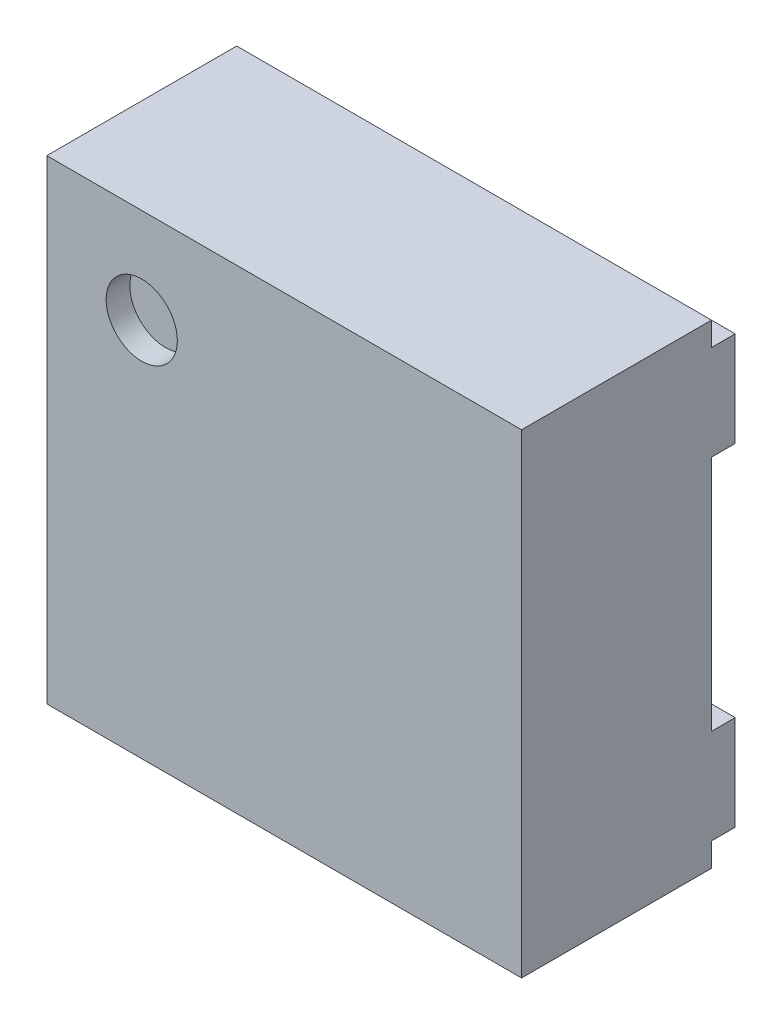
ISO-10303-21;
HEADER;
FILE_DESCRIPTION(('STEP AP214'),'2;1');
FILE_NAME('part.step','',(''),(''),'','','');
FILE_SCHEMA(('AUTOMOTIVE_DESIGN { 1 0 10303 214 1 1 1 1 }'));
ENDSEC;
DATA;
#1=APPLICATION_CONTEXT('core data for automotive mechanical design processes');
#2=APPLICATION_PROTOCOL_DEFINITION('international standard','automotive_design',2000,#1);
#3=PRODUCT_CONTEXT('',#1,'mechanical');
#4=PRODUCT('Part','Part','',(#3));
#5=PRODUCT_RELATED_PRODUCT_CATEGORY('part','',(#4));
#6=PRODUCT_DEFINITION_FORMATION('','',#4);
#7=PRODUCT_DEFINITION_CONTEXT('part definition',#1,'design');
#8=PRODUCT_DEFINITION('design','',#6,#7);
#9=PRODUCT_DEFINITION_SHAPE('','',#8);
#10=(LENGTH_UNIT() NAMED_UNIT(*) SI_UNIT(.MILLI.,.METRE.));
#11=(NAMED_UNIT(*) PLANE_ANGLE_UNIT() SI_UNIT($,.RADIAN.));
#12=(NAMED_UNIT(*) SI_UNIT($,.STERADIAN.) SOLID_ANGLE_UNIT());
#13=UNCERTAINTY_MEASURE_WITH_UNIT(LENGTH_MEASURE(1.E-05),#10,'distance_accuracy_value','');
#14=(GEOMETRIC_REPRESENTATION_CONTEXT(3) GLOBAL_UNCERTAINTY_ASSIGNED_CONTEXT((#13)) GLOBAL_UNIT_ASSIGNED_CONTEXT((#10,
#11,#12)) REPRESENTATION_CONTEXT('',''));
#15=CARTESIAN_POINT('',(0.,0.,0.));
#16=DIRECTION('',(0.,0.,1.));
#17=DIRECTION('',(1.,0.,0.));
#18=AXIS2_PLACEMENT_3D('',#15,#16,#17);
#19=CARTESIAN_POINT('',(0.39594875162,0.369759001296,-0.05));
#20=DIRECTION('',(0.,0.,-1.));
#21=DIRECTION('',(-1.,0.,0.));
#22=AXIS2_PLACEMENT_3D('',#19,#20,#21);
#23=PLANE('',#22);
#24=DIRECTION('',(0.,1.,0.));
#25=VECTOR('',#24,1.);
#26=CARTESIAN_POINT('',(0.25,0.4,-0.05));
#27=LINE('',#26,#25);
#28=CARTESIAN_POINT('',(0.25,0.45,-0.05));
#29=VERTEX_POINT('',#28);
#30=CARTESIAN_POINT('',(0.249999999999995,0.399999999999994,-0.05));
#31=VERTEX_POINT('',#30);
#32=EDGE_CURVE('E401',#29,#31,#27,.F.);
#33=ORIENTED_EDGE('',*,*,#32,.F.);
#34=DIRECTION('',(1.,0.,0.));
#35=VECTOR('',#34,1.);
#36=CARTESIAN_POINT('',(0.25,0.45,-0.05));
#37=LINE('',#36,#35);
#38=CARTESIAN_POINT('',(0.5,0.45,-0.05));
#39=VERTEX_POINT('',#38);
#40=EDGE_CURVE('E395',#39,#29,#37,.F.);
#41=ORIENTED_EDGE('',*,*,#40,.F.);
#42=DIRECTION('',(0.,1.,0.));
#43=VECTOR('',#42,1.);
#44=CARTESIAN_POINT('',(0.5,0.45,-0.05));
#45=LINE('',#44,#43);
#46=CARTESIAN_POINT('',(0.5,0.25,-0.05));
#47=VERTEX_POINT('',#46);
#48=EDGE_CURVE('E438',#47,#39,#45,.T.);
#49=ORIENTED_EDGE('',*,*,#48,.F.);
#50=DIRECTION('',(1.,0.,0.));
#51=VECTOR('',#50,1.);
#52=CARTESIAN_POINT('',(0.5,0.25,-0.05));
#53=LINE('',#52,#51);
#54=CARTESIAN_POINT('',(0.43,0.25,-0.05));
#55=VERTEX_POINT('',#54);
#56=EDGE_CURVE('E412',#55,#47,#53,.T.);
#57=ORIENTED_EDGE('',*,*,#56,.F.);
#58=DIRECTION('',(0.768221279597458,-0.640184399664382,0.));
#59=VECTOR('',#58,1.);
#60=CARTESIAN_POINT('',(0.43,0.25,-0.05));
#61=LINE('',#60,#59);
#62=EDGE_CURVE('E407',#31,#55,#61,.T.);
#63=ORIENTED_EDGE('',*,*,#62,.F.);
#64=EDGE_LOOP('',(#33,#41,#49,#57,#63));
#65=FACE_BOUND('',#64,.T.);
#66=ADVANCED_FACE('F17',(#65),#23,.T.);
#67=CARTESIAN_POINT('',(-0.39594875162,0.369759001296,-0.05));
#68=DIRECTION('',(0.,0.,1.));
#69=DIRECTION('',(1.,0.,0.));
#70=AXIS2_PLACEMENT_3D('',#67,#68,#69);
#71=PLANE('',#70);
#72=DIRECTION('',(0.,1.,0.));
#73=VECTOR('',#72,1.);
#74=CARTESIAN_POINT('',(-0.25,0.4,-0.05));
#75=LINE('',#74,#73);
#76=CARTESIAN_POINT('',(-0.25,0.45,-0.05));
#77=VERTEX_POINT('',#76);
#78=CARTESIAN_POINT('',(-0.249999999999995,0.399999999999994,-0.05));
#79=VERTEX_POINT('',#78);
#80=EDGE_CURVE('E382',#77,#79,#75,.F.);
#81=ORIENTED_EDGE('',*,*,#80,.T.);
#82=DIRECTION('',(-0.768221279597458,-0.640184399664382,0.));
#83=VECTOR('',#82,1.);
#84=CARTESIAN_POINT('',(-0.43,0.25,-0.05));
#85=LINE('',#84,#83);
#86=CARTESIAN_POINT('',(-0.43,0.25,-0.05));
#87=VERTEX_POINT('',#86);
#88=EDGE_CURVE('E377',#79,#87,#85,.T.);
#89=ORIENTED_EDGE('',*,*,#88,.T.);
#90=DIRECTION('',(1.,0.,0.));
#91=VECTOR('',#90,1.);
#92=CARTESIAN_POINT('',(-0.5,0.25,-0.05));
#93=LINE('',#92,#91);
#94=CARTESIAN_POINT('',(-0.5,0.25,-0.05));
#95=VERTEX_POINT('',#94);
#96=EDGE_CURVE('E372',#87,#95,#93,.F.);
#97=ORIENTED_EDGE('',*,*,#96,.T.);
#98=DIRECTION('',(0.,1.,0.));
#99=VECTOR('',#98,1.);
#100=CARTESIAN_POINT('',(-0.5,0.45,-0.05));
#101=LINE('',#100,#99);
#102=CARTESIAN_POINT('',(-0.5,0.45,-0.05));
#103=VERTEX_POINT('',#102);
#104=EDGE_CURVE('E440',#95,#103,#101,.T.);
#105=ORIENTED_EDGE('',*,*,#104,.T.);
#106=DIRECTION('',(1.,0.,0.));
#107=VECTOR('',#106,1.);
#108=CARTESIAN_POINT('',(-0.25,0.45,-0.05));
#109=LINE('',#108,#107);
#110=EDGE_CURVE('E387',#103,#77,#109,.T.);
#111=ORIENTED_EDGE('',*,*,#110,.T.);
#112=EDGE_LOOP('',(#81,#89,#97,#105,#111));
#113=FACE_BOUND('',#112,.T.);
#114=ADVANCED_FACE('F640',(#113),#71,.F.);
#115=CARTESIAN_POINT('',(-0.39594875162,-0.369759001296,-0.05));
#116=DIRECTION('',(0.,0.,-1.));
#117=DIRECTION('',(-1.,0.,0.));
#118=AXIS2_PLACEMENT_3D('',#115,#116,#117);
#119=PLANE('',#118);
#120=DIRECTION('',(0.,1.,0.));
#121=VECTOR('',#120,1.);
#122=CARTESIAN_POINT('',(-0.25,-0.4,-0.05));
#123=LINE('',#122,#121);
#124=CARTESIAN_POINT('',(-0.25,-0.45,-0.05));
#125=VERTEX_POINT('',#124);
#126=CARTESIAN_POINT('',(-0.249999999999995,-0.399999999999994,-0.05));
#127=VERTEX_POINT('',#126);
#128=EDGE_CURVE('E353',#125,#127,#123,.T.);
#129=ORIENTED_EDGE('',*,*,#128,.F.);
#130=DIRECTION('',(1.,0.,0.));
#131=VECTOR('',#130,1.);
#132=CARTESIAN_POINT('',(-0.25,-0.45,-0.05));
#133=LINE('',#132,#131);
#134=CARTESIAN_POINT('',(-0.5,-0.45,-0.05));
#135=VERTEX_POINT('',#134);
#136=EDGE_CURVE('E435',#135,#125,#133,.T.);
#137=ORIENTED_EDGE('',*,*,#136,.F.);
#138=DIRECTION('',(0.,1.,0.));
#139=VECTOR('',#138,1.);
#140=CARTESIAN_POINT('',(-0.5,-0.45,-0.05));
#141=LINE('',#140,#139);
#142=CARTESIAN_POINT('',(-0.5,-0.25,-0.05));
#143=VERTEX_POINT('',#142);
#144=EDGE_CURVE('E239',#143,#135,#141,.F.);
#145=ORIENTED_EDGE('',*,*,#144,.F.);
#146=DIRECTION('',(1.,0.,0.));
#147=VECTOR('',#146,1.);
#148=CARTESIAN_POINT('',(-0.5,-0.25,-0.05));
#149=LINE('',#148,#147);
#150=CARTESIAN_POINT('',(-0.43,-0.25,-0.05));
#151=VERTEX_POINT('',#150);
#152=EDGE_CURVE('E364',#151,#143,#149,.F.);
#153=ORIENTED_EDGE('',*,*,#152,.F.);
#154=DIRECTION('',(-0.768221279597458,0.640184399664382,0.));
#155=VECTOR('',#154,1.);
#156=CARTESIAN_POINT('',(-0.43,-0.25,-0.05));
#157=LINE('',#156,#155);
#158=EDGE_CURVE('E359',#127,#151,#157,.T.);
#159=ORIENTED_EDGE('',*,*,#158,.F.);
#160=EDGE_LOOP('',(#129,#137,#145,#153,#159));
#161=FACE_BOUND('',#160,.T.);
#162=ADVANCED_FACE('F644',(#161),#119,.T.);
#163=CARTESIAN_POINT('',(-0.003307671123042,0.003307671123042,-0.05));
#164=DIRECTION('',(0.,0.,1.));
#165=DIRECTION('',(1.,0.,0.));
#166=AXIS2_PLACEMENT_3D('',#163,#164,#165);
#167=PLANE('',#166);
#168=CARTESIAN_POINT('',(-0.164807389148,0.164807389148,-0.05));
#169=DIRECTION('',(0.,0.,-1.));
#170=DIRECTION('',(-1.,0.,0.));
#171=AXIS2_PLACEMENT_3D('',#168,#169,#170);
#172=CIRCLE('',#171,0.04059538739318);
#173=CARTESIAN_POINT('',(-0.197989898732166,0.141421356237327,-0.05));
#174=VERTEX_POINT('',#173);
#175=CARTESIAN_POINT('',(-0.141421356237562,0.197989898732438,-0.05));
#176=VERTEX_POINT('',#175);
#177=EDGE_CURVE('E20',#174,#176,#172,.F.);
#178=ORIENTED_EDGE('',*,*,#177,.T.);
#179=DIRECTION('',(0.707106781186548,0.707106781186548,0.));
#180=VECTOR('',#179,1.);
#181=CARTESIAN_POINT('',(0.,0.33941125497,-0.05));
#182=LINE('',#181,#180);
#183=CARTESIAN_POINT('',(0.,0.33941125497,-0.05));
#184=VERTEX_POINT('',#183);
#185=EDGE_CURVE('E218',#176,#184,#182,.T.);
#186=ORIENTED_EDGE('',*,*,#185,.T.);
#187=DIRECTION('',(0.707106781186548,-0.707106781186548,0.));
#188=VECTOR('',#187,1.);
#189=CARTESIAN_POINT('',(0.33941125497,0.,-0.05));
#190=LINE('',#189,#188);
#191=CARTESIAN_POINT('',(0.33941125497,0.,-0.05));
#192=VERTEX_POINT('',#191);
#193=EDGE_CURVE('E230',#184,#192,#190,.T.);
#194=ORIENTED_EDGE('',*,*,#193,.T.);
#195=DIRECTION('',(-0.707106781186548,-0.707106781186548,0.));
#196=VECTOR('',#195,1.);
#197=CARTESIAN_POINT('',(0.,-0.33941125497,-0.05));
#198=LINE('',#197,#196);
#199=CARTESIAN_POINT('',(0.,-0.33941125497,-0.05));
#200=VERTEX_POINT('',#199);
#201=EDGE_CURVE('E247',#192,#200,#198,.T.);
#202=ORIENTED_EDGE('',*,*,#201,.T.);
#203=DIRECTION('',(-0.707106781186548,0.707106781186548,0.));
#204=VECTOR('',#203,1.);
#205=CARTESIAN_POINT('',(-0.33941125497,0.,-0.05));
#206=LINE('',#205,#204);
#207=CARTESIAN_POINT('',(-0.33941125497,0.,-0.05));
#208=VERTEX_POINT('',#207);
#209=EDGE_CURVE('E249',#200,#208,#206,.T.);
#210=ORIENTED_EDGE('',*,*,#209,.T.);
#211=DIRECTION('',(-0.707106781186548,-0.707106781186548,0.));
#212=VECTOR('',#211,1.);
#213=CARTESIAN_POINT('',(-0.33941125497,0.,-0.05));
#214=LINE('',#213,#212);
#215=EDGE_CURVE('E212',#174,#208,#214,.T.);
#216=ORIENTED_EDGE('',*,*,#215,.F.);
#217=EDGE_LOOP('',(#178,#186,#194,#202,#210,#216));
#218=FACE_BOUND('',#217,.T.);
#219=ADVANCED_FACE('F216',(#218),#167,.F.);
#220=CARTESIAN_POINT('',(0.39594875162,-0.369759001296,-0.05));
#221=DIRECTION('',(0.,0.,1.));
#222=DIRECTION('',(1.,0.,0.));
#223=AXIS2_PLACEMENT_3D('',#220,#221,#222);
#224=PLANE('',#223);
#225=DIRECTION('',(0.,1.,0.));
#226=VECTOR('',#225,1.);
#227=CARTESIAN_POINT('',(0.25,-0.4,-0.05));
#228=LINE('',#227,#226);
#229=CARTESIAN_POINT('',(0.25,-0.45,-0.05));
#230=VERTEX_POINT('',#229);
#231=CARTESIAN_POINT('',(0.249999999999995,-0.399999999999994,-0.05));
#232=VERTEX_POINT('',#231);
#233=EDGE_CURVE('E428',#230,#232,#228,.T.);
#234=ORIENTED_EDGE('',*,*,#233,.T.);
#235=DIRECTION('',(0.768221279597458,0.640184399664382,0.));
#236=VECTOR('',#235,1.);
#237=CARTESIAN_POINT('',(0.43,-0.25,-0.05));
#238=LINE('',#237,#236);
#239=CARTESIAN_POINT('',(0.43,-0.25,-0.05));
#240=VERTEX_POINT('',#239);
#241=EDGE_CURVE('E423',#232,#240,#238,.T.);
#242=ORIENTED_EDGE('',*,*,#241,.T.);
#243=DIRECTION('',(1.,0.,0.));
#244=VECTOR('',#243,1.);
#245=CARTESIAN_POINT('',(0.5,-0.25,-0.05));
#246=LINE('',#245,#244);
#247=CARTESIAN_POINT('',(0.5,-0.25,-0.05));
#248=VERTEX_POINT('',#247);
#249=EDGE_CURVE('E418',#240,#248,#246,.T.);
#250=ORIENTED_EDGE('',*,*,#249,.T.);
#251=DIRECTION('',(0.,1.,0.));
#252=VECTOR('',#251,1.);
#253=CARTESIAN_POINT('',(0.5,-0.45,-0.05));
#254=LINE('',#253,#252);
#255=CARTESIAN_POINT('',(0.5,-0.45,-0.05));
#256=VERTEX_POINT('',#255);
#257=EDGE_CURVE('E322',#248,#256,#254,.F.);
#258=ORIENTED_EDGE('',*,*,#257,.T.);
#259=DIRECTION('',(1.,0.,0.));
#260=VECTOR('',#259,1.);
#261=CARTESIAN_POINT('',(0.25,-0.45,-0.05));
#262=LINE('',#261,#260);
#263=EDGE_CURVE('E430',#256,#230,#262,.F.);
#264=ORIENTED_EDGE('',*,*,#263,.T.);
#265=EDGE_LOOP('',(#234,#242,#250,#258,#264));
#266=FACE_BOUND('',#265,.T.);
#267=ADVANCED_FACE('F525',(#266),#224,.F.);
#268=CARTESIAN_POINT('',(-0.25,-0.45,-0.05));
#269=DIRECTION('',(0.,-1.,0.));
#270=DIRECTION('',(0.,0.,-1.));
#271=AXIS2_PLACEMENT_3D('',#268,#269,#270);
#272=PLANE('',#271);
#273=DIRECTION('',(1.,0.,0.));
#274=VECTOR('',#273,1.);
#275=CARTESIAN_POINT('',(0.,-0.45,0.));
#276=LINE('',#275,#274);
#277=CARTESIAN_POINT('',(-0.25,-0.45,0.));
#278=VERTEX_POINT('',#277);
#279=CARTESIAN_POINT('',(-0.5,-0.45,0.));
#280=VERTEX_POINT('',#279);
#281=EDGE_CURVE('E314',#278,#280,#276,.F.);
#282=ORIENTED_EDGE('',*,*,#281,.T.);
#283=DIRECTION('',(0.,0.,-1.));
#284=VECTOR('',#283,1.);
#285=CARTESIAN_POINT('',(-0.5,-0.45,-0.05));
#286=LINE('',#285,#284);
#287=EDGE_CURVE('E432',#280,#135,#286,.T.);
#288=ORIENTED_EDGE('',*,*,#287,.T.);
#289=ORIENTED_EDGE('',*,*,#136,.T.);
#290=DIRECTION('',(0.,0.,-1.));
#291=VECTOR('',#290,1.);
#292=CARTESIAN_POINT('',(-0.25,-0.45,-0.05));
#293=LINE('',#292,#291);
#294=EDGE_CURVE('E250',#278,#125,#293,.T.);
#295=ORIENTED_EDGE('',*,*,#294,.F.);
#296=EDGE_LOOP('',(#282,#288,#289,#295));
#297=FACE_BOUND('',#296,.T.);
#298=ADVANCED_FACE('F451',(#297),#272,.T.);
#299=CARTESIAN_POINT('',(0.25,-0.45,-0.05));
#300=DIRECTION('',(0.,1.,0.));
#301=DIRECTION('',(0.,0.,1.));
#302=AXIS2_PLACEMENT_3D('',#299,#300,#301);
#303=PLANE('',#302);
#304=DIRECTION('',(1.,0.,0.));
#305=VECTOR('',#304,1.);
#306=CARTESIAN_POINT('',(0.,-0.45,0.));
#307=LINE('',#306,#305);
#308=CARTESIAN_POINT('',(0.5,-0.45,0.));
#309=VERTEX_POINT('',#308);
#310=CARTESIAN_POINT('',(0.25,-0.45,0.));
#311=VERTEX_POINT('',#310);
#312=EDGE_CURVE('E312',#309,#311,#307,.F.);
#313=ORIENTED_EDGE('',*,*,#312,.T.);
#314=DIRECTION('',(0.,0.,-1.));
#315=VECTOR('',#314,1.);
#316=CARTESIAN_POINT('',(0.25,-0.45,-0.05));
#317=LINE('',#316,#315);
#318=EDGE_CURVE('E425',#311,#230,#317,.T.);
#319=ORIENTED_EDGE('',*,*,#318,.T.);
#320=ORIENTED_EDGE('',*,*,#263,.F.);
#321=DIRECTION('',(0.,0.,1.));
#322=VECTOR('',#321,1.);
#323=CARTESIAN_POINT('',(0.5,-0.45,-0.05));
#324=LINE('',#323,#322);
#325=EDGE_CURVE('E320',#256,#309,#324,.T.);
#326=ORIENTED_EDGE('',*,*,#325,.T.);
#327=EDGE_LOOP('',(#313,#319,#320,#326));
#328=FACE_BOUND('',#327,.T.);
#329=ADVANCED_FACE('F517',(#328),#303,.F.);
#330=CARTESIAN_POINT('',(0.25,-0.4,-0.05));
#331=DIRECTION('',(1.,0.,0.));
#332=DIRECTION('',(0.,0.,-1.));
#333=AXIS2_PLACEMENT_3D('',#330,#331,#332);
#334=PLANE('',#333);
#335=DIRECTION('',(0.,1.,0.));
#336=VECTOR('',#335,1.);
#337=CARTESIAN_POINT('',(0.25,0.,0.));
#338=LINE('',#337,#336);
#339=CARTESIAN_POINT('',(0.249999999999995,-0.399999999999994,0.));
#340=VERTEX_POINT('',#339);
#341=EDGE_CURVE('E310',#311,#340,#338,.T.);
#342=ORIENTED_EDGE('',*,*,#341,.T.);
#343=DIRECTION('',(0.,0.,1.));
#344=VECTOR('',#343,1.);
#345=CARTESIAN_POINT('',(0.249999999999981,-0.399999999999977,-0.05));
#346=LINE('',#345,#344);
#347=EDGE_CURVE('E420',#340,#232,#346,.F.);
#348=ORIENTED_EDGE('',*,*,#347,.T.);
#349=ORIENTED_EDGE('',*,*,#233,.F.);
#350=ORIENTED_EDGE('',*,*,#318,.F.);
#351=EDGE_LOOP('',(#342,#348,#349,#350));
#352=FACE_BOUND('',#351,.T.);
#353=ADVANCED_FACE('F521',(#352),#334,.F.);
#354=CARTESIAN_POINT('',(0.43,-0.25,-0.05));
#355=DIRECTION('',(0.640184399664382,-0.768221279597458,0.));
#356=DIRECTION('',(0.768221279597458,0.640184399664382,0.));
#357=AXIS2_PLACEMENT_3D('',#354,#355,#356);
#358=PLANE('',#357);
#359=DIRECTION('',(0.768221279597376,0.64018439966448,0.));
#360=VECTOR('',#359,1.);
#361=CARTESIAN_POINT('',(0.25,-0.4,0.));
#362=LINE('',#361,#360);
#363=CARTESIAN_POINT('',(0.43,-0.25,0.));
#364=VERTEX_POINT('',#363);
#365=EDGE_CURVE('E308',#340,#364,#362,.T.);
#366=ORIENTED_EDGE('',*,*,#365,.T.);
#367=DIRECTION('',(0.,0.,-1.));
#368=VECTOR('',#367,1.);
#369=CARTESIAN_POINT('',(0.43,-0.25,-0.05));
#370=LINE('',#369,#368);
#371=EDGE_CURVE('E415',#364,#240,#370,.T.);
#372=ORIENTED_EDGE('',*,*,#371,.T.);
#373=ORIENTED_EDGE('',*,*,#241,.F.);
#374=ORIENTED_EDGE('',*,*,#347,.F.);
#375=EDGE_LOOP('',(#366,#372,#373,#374));
#376=FACE_BOUND('',#375,.T.);
#377=ADVANCED_FACE('F661',(#376),#358,.F.);
#378=CARTESIAN_POINT('',(0.5,-0.25,-0.05));
#379=DIRECTION('',(0.,-1.,0.));
#380=DIRECTION('',(0.,0.,-1.));
#381=AXIS2_PLACEMENT_3D('',#378,#379,#380);
#382=PLANE('',#381);
#383=DIRECTION('',(1.,0.,0.));
#384=VECTOR('',#383,1.);
#385=CARTESIAN_POINT('',(0.,-0.25,0.));
#386=LINE('',#385,#384);
#387=CARTESIAN_POINT('',(0.5,-0.25,0.));
#388=VERTEX_POINT('',#387);
#389=EDGE_CURVE('E306',#364,#388,#386,.T.);
#390=ORIENTED_EDGE('',*,*,#389,.T.);
#391=DIRECTION('',(0.,0.,1.));
#392=VECTOR('',#391,1.);
#393=CARTESIAN_POINT('',(0.5,-0.25,-0.05));
#394=LINE('',#393,#392);
#395=EDGE_CURVE('E317',#388,#248,#394,.F.);
#396=ORIENTED_EDGE('',*,*,#395,.T.);
#397=ORIENTED_EDGE('',*,*,#249,.F.);
#398=ORIENTED_EDGE('',*,*,#371,.F.);
#399=EDGE_LOOP('',(#390,#396,#397,#398));
#400=FACE_BOUND('',#399,.T.);
#401=ADVANCED_FACE('F664',(#400),#382,.F.);
#402=CARTESIAN_POINT('',(0.5,0.25,-0.05));
#403=DIRECTION('',(0.,-1.,0.));
#404=DIRECTION('',(0.,0.,-1.));
#405=AXIS2_PLACEMENT_3D('',#402,#403,#404);
#406=PLANE('',#405);
#407=DIRECTION('',(1.,0.,0.));
#408=VECTOR('',#407,1.);
#409=CARTESIAN_POINT('',(0.,0.25,0.));
#410=LINE('',#409,#408);
#411=CARTESIAN_POINT('',(0.5,0.25,0.));
#412=VERTEX_POINT('',#411);
#413=CARTESIAN_POINT('',(0.43,0.25,0.));
#414=VERTEX_POINT('',#413);
#415=EDGE_CURVE('E304',#412,#414,#410,.F.);
#416=ORIENTED_EDGE('',*,*,#415,.T.);
#417=DIRECTION('',(0.,0.,1.));
#418=VECTOR('',#417,1.);
#419=CARTESIAN_POINT('',(0.43,0.25,-0.05));
#420=LINE('',#419,#418);
#421=EDGE_CURVE('E404',#55,#414,#420,.T.);
#422=ORIENTED_EDGE('',*,*,#421,.F.);
#423=ORIENTED_EDGE('',*,*,#56,.T.);
#424=DIRECTION('',(0.,0.,-1.));
#425=VECTOR('',#424,1.);
#426=CARTESIAN_POINT('',(0.5,0.25,-0.05));
#427=LINE('',#426,#425);
#428=EDGE_CURVE('E410',#47,#412,#427,.F.);
#429=ORIENTED_EDGE('',*,*,#428,.T.);
#430=EDGE_LOOP('',(#416,#422,#423,#429));
#431=FACE_BOUND('',#430,.T.);
#432=ADVANCED_FACE('F537',(#431),#406,.T.);
#433=CARTESIAN_POINT('',(0.43,0.25,-0.05));
#434=DIRECTION('',(-0.640184399664382,-0.768221279597458,0.));
#435=DIRECTION('',(0.768221279597458,-0.640184399664382,0.));
#436=AXIS2_PLACEMENT_3D('',#433,#434,#435);
#437=PLANE('',#436);
#438=DIRECTION('',(-0.768221279597376,0.64018439966448,0.));
#439=VECTOR('',#438,1.);
#440=CARTESIAN_POINT('',(0.43,0.25,0.));
#441=LINE('',#440,#439);
#442=CARTESIAN_POINT('',(0.24999999999999,0.399999999999988,0.));
#443=VERTEX_POINT('',#442);
#444=EDGE_CURVE('E302',#414,#443,#441,.T.);
#445=ORIENTED_EDGE('',*,*,#444,.T.);
#446=DIRECTION('',(0.,0.,1.));
#447=VECTOR('',#446,1.);
#448=CARTESIAN_POINT('',(0.25,0.4,-0.05));
#449=LINE('',#448,#447);
#450=EDGE_CURVE('E398',#31,#443,#449,.T.);
#451=ORIENTED_EDGE('',*,*,#450,.F.);
#452=ORIENTED_EDGE('',*,*,#62,.T.);
#453=ORIENTED_EDGE('',*,*,#421,.T.);
#454=EDGE_LOOP('',(#445,#451,#452,#453));
#455=FACE_BOUND('',#454,.T.);
#456=ADVANCED_FACE('F539',(#455),#437,.T.);
#457=CARTESIAN_POINT('',(0.25,0.4,-0.05));
#458=DIRECTION('',(-1.,0.,0.));
#459=DIRECTION('',(0.,0.,1.));
#460=AXIS2_PLACEMENT_3D('',#457,#458,#459);
#461=PLANE('',#460);
#462=DIRECTION('',(0.,1.,0.));
#463=VECTOR('',#462,1.);
#464=CARTESIAN_POINT('',(0.25,0.,0.));
#465=LINE('',#464,#463);
#466=CARTESIAN_POINT('',(0.25,0.45,0.));
#467=VERTEX_POINT('',#466);
#468=EDGE_CURVE('E300',#443,#467,#465,.T.);
#469=ORIENTED_EDGE('',*,*,#468,.T.);
#470=DIRECTION('',(0.,0.,1.));
#471=VECTOR('',#470,1.);
#472=CARTESIAN_POINT('',(0.25,0.45,-0.05));
#473=LINE('',#472,#471);
#474=EDGE_CURVE('E392',#29,#467,#473,.T.);
#475=ORIENTED_EDGE('',*,*,#474,.F.);
#476=ORIENTED_EDGE('',*,*,#32,.T.);
#477=ORIENTED_EDGE('',*,*,#450,.T.);
#478=EDGE_LOOP('',(#469,#475,#476,#477));
#479=FACE_BOUND('',#478,.T.);
#480=ADVANCED_FACE('F546',(#479),#461,.T.);
#481=CARTESIAN_POINT('',(0.25,0.45,-0.05));
#482=DIRECTION('',(0.,1.,0.));
#483=DIRECTION('',(0.,0.,1.));
#484=AXIS2_PLACEMENT_3D('',#481,#482,#483);
#485=PLANE('',#484);
#486=DIRECTION('',(1.,0.,0.));
#487=VECTOR('',#486,1.);
#488=CARTESIAN_POINT('',(0.,0.45,0.));
#489=LINE('',#488,#487);
#490=CARTESIAN_POINT('',(0.5,0.45,0.));
#491=VERTEX_POINT('',#490);
#492=EDGE_CURVE('E297',#467,#491,#489,.T.);
#493=ORIENTED_EDGE('',*,*,#492,.T.);
#494=DIRECTION('',(0.,0.,1.));
#495=VECTOR('',#494,1.);
#496=CARTESIAN_POINT('',(0.5,0.45,-0.05));
#497=LINE('',#496,#495);
#498=EDGE_CURVE('E389',#491,#39,#497,.F.);
#499=ORIENTED_EDGE('',*,*,#498,.T.);
#500=ORIENTED_EDGE('',*,*,#40,.T.);
#501=ORIENTED_EDGE('',*,*,#474,.T.);
#502=EDGE_LOOP('',(#493,#499,#500,#501));
#503=FACE_BOUND('',#502,.T.);
#504=ADVANCED_FACE('F544',(#503),#485,.T.);
#505=CARTESIAN_POINT('',(-0.25,0.45,-0.05));
#506=DIRECTION('',(0.,-1.,0.));
#507=DIRECTION('',(0.,0.,-1.));
#508=AXIS2_PLACEMENT_3D('',#505,#506,#507);
#509=PLANE('',#508);
#510=DIRECTION('',(1.,0.,0.));
#511=VECTOR('',#510,1.);
#512=CARTESIAN_POINT('',(0.,0.45,0.));
#513=LINE('',#512,#511);
#514=CARTESIAN_POINT('',(-0.5,0.45,0.));
#515=VERTEX_POINT('',#514);
#516=CARTESIAN_POINT('',(-0.25,0.45,0.));
#517=VERTEX_POINT('',#516);
#518=EDGE_CURVE('E295',#515,#517,#513,.T.);
#519=ORIENTED_EDGE('',*,*,#518,.T.);
#520=DIRECTION('',(0.,0.,1.));
#521=VECTOR('',#520,1.);
#522=CARTESIAN_POINT('',(-0.25,0.45,-0.05));
#523=LINE('',#522,#521);
#524=EDGE_CURVE('E379',#517,#77,#523,.F.);
#525=ORIENTED_EDGE('',*,*,#524,.T.);
#526=ORIENTED_EDGE('',*,*,#110,.F.);
#527=DIRECTION('',(0.,0.,-1.));
#528=VECTOR('',#527,1.);
#529=CARTESIAN_POINT('',(-0.5,0.45,-0.05));
#530=LINE('',#529,#528);
#531=EDGE_CURVE('E384',#515,#103,#530,.T.);
#532=ORIENTED_EDGE('',*,*,#531,.F.);
#533=EDGE_LOOP('',(#519,#525,#526,#532));
#534=FACE_BOUND('',#533,.T.);
#535=ADVANCED_FACE('F554',(#534),#509,.F.);
#536=CARTESIAN_POINT('',(-0.25,0.4,-0.05));
#537=DIRECTION('',(-1.,0.,0.));
#538=DIRECTION('',(0.,0.,1.));
#539=AXIS2_PLACEMENT_3D('',#536,#537,#538);
#540=PLANE('',#539);
#541=DIRECTION('',(0.,1.,0.));
#542=VECTOR('',#541,1.);
#543=CARTESIAN_POINT('',(-0.25,0.,0.));
#544=LINE('',#543,#542);
#545=CARTESIAN_POINT('',(-0.249999999999995,0.399999999999994,0.));
#546=VERTEX_POINT('',#545);
#547=EDGE_CURVE('E293',#517,#546,#544,.F.);
#548=ORIENTED_EDGE('',*,*,#547,.T.);
#549=DIRECTION('',(0.,0.,1.));
#550=VECTOR('',#549,1.);
#551=CARTESIAN_POINT('',(-0.249999999999981,0.399999999999977,-0.05));
#552=LINE('',#551,#550);
#553=EDGE_CURVE('E374',#546,#79,#552,.F.);
#554=ORIENTED_EDGE('',*,*,#553,.T.);
#555=ORIENTED_EDGE('',*,*,#80,.F.);
#556=ORIENTED_EDGE('',*,*,#524,.F.);
#557=EDGE_LOOP('',(#548,#554,#555,#556));
#558=FACE_BOUND('',#557,.T.);
#559=ADVANCED_FACE('F620',(#558),#540,.F.);
#560=CARTESIAN_POINT('',(-0.43,0.25,-0.05));
#561=DIRECTION('',(-0.640184399664382,0.768221279597458,0.));
#562=DIRECTION('',(-0.768221279597458,-0.640184399664382,0.));
#563=AXIS2_PLACEMENT_3D('',#560,#561,#562);
#564=PLANE('',#563);
#565=DIRECTION('',(-0.768221279597376,-0.64018439966448,0.));
#566=VECTOR('',#565,1.);
#567=CARTESIAN_POINT('',(-0.25,0.4,0.));
#568=LINE('',#567,#566);
#569=CARTESIAN_POINT('',(-0.43,0.25,0.));
#570=VERTEX_POINT('',#569);
#571=EDGE_CURVE('E291',#546,#570,#568,.T.);
#572=ORIENTED_EDGE('',*,*,#571,.T.);
#573=DIRECTION('',(0.,0.,1.));
#574=VECTOR('',#573,1.);
#575=CARTESIAN_POINT('',(-0.43,0.25,-0.05));
#576=LINE('',#575,#574);
#577=EDGE_CURVE('E367',#570,#87,#576,.F.);
#578=ORIENTED_EDGE('',*,*,#577,.T.);
#579=ORIENTED_EDGE('',*,*,#88,.F.);
#580=ORIENTED_EDGE('',*,*,#553,.F.);
#581=EDGE_LOOP('',(#572,#578,#579,#580));
#582=FACE_BOUND('',#581,.T.);
#583=ADVANCED_FACE('F616',(#582),#564,.F.);
#584=CARTESIAN_POINT('',(-0.5,0.25,-0.05));
#585=DIRECTION('',(0.,1.,0.));
#586=DIRECTION('',(0.,0.,1.));
#587=AXIS2_PLACEMENT_3D('',#584,#585,#586);
#588=PLANE('',#587);
#589=DIRECTION('',(1.,0.,0.));
#590=VECTOR('',#589,1.);
#591=CARTESIAN_POINT('',(0.,0.25,0.));
#592=LINE('',#591,#590);
#593=CARTESIAN_POINT('',(-0.5,0.25,0.));
#594=VERTEX_POINT('',#593);
#595=EDGE_CURVE('E288',#570,#594,#592,.F.);
#596=ORIENTED_EDGE('',*,*,#595,.T.);
#597=DIRECTION('',(0.,0.,1.));
#598=VECTOR('',#597,1.);
#599=CARTESIAN_POINT('',(-0.5,0.25,-0.05));
#600=LINE('',#599,#598);
#601=EDGE_CURVE('E370',#95,#594,#600,.T.);
#602=ORIENTED_EDGE('',*,*,#601,.F.);
#603=ORIENTED_EDGE('',*,*,#96,.F.);
#604=ORIENTED_EDGE('',*,*,#577,.F.);
#605=EDGE_LOOP('',(#596,#602,#603,#604));
#606=FACE_BOUND('',#605,.T.);
#607=ADVANCED_FACE('F612',(#606),#588,.F.);
#608=CARTESIAN_POINT('',(-0.5,-0.25,-0.05));
#609=DIRECTION('',(0.,1.,0.));
#610=DIRECTION('',(0.,0.,1.));
#611=AXIS2_PLACEMENT_3D('',#608,#609,#610);
#612=PLANE('',#611);
#613=DIRECTION('',(1.,0.,0.));
#614=VECTOR('',#613,1.);
#615=CARTESIAN_POINT('',(0.,-0.25,0.));
#616=LINE('',#615,#614);
#617=CARTESIAN_POINT('',(-0.5,-0.25,0.));
#618=VERTEX_POINT('',#617);
#619=CARTESIAN_POINT('',(-0.43,-0.25,0.));
#620=VERTEX_POINT('',#619);
#621=EDGE_CURVE('E286',#618,#620,#616,.T.);
#622=ORIENTED_EDGE('',*,*,#621,.T.);
#623=DIRECTION('',(0.,0.,1.));
#624=VECTOR('',#623,1.);
#625=CARTESIAN_POINT('',(-0.43,-0.25,-0.05));
#626=LINE('',#625,#624);
#627=EDGE_CURVE('E356',#151,#620,#626,.T.);
#628=ORIENTED_EDGE('',*,*,#627,.F.);
#629=ORIENTED_EDGE('',*,*,#152,.T.);
#630=DIRECTION('',(0.,0.,1.));
#631=VECTOR('',#630,1.);
#632=CARTESIAN_POINT('',(-0.5,-0.25,-0.05));
#633=LINE('',#632,#631);
#634=EDGE_CURVE('E362',#143,#618,#633,.T.);
#635=ORIENTED_EDGE('',*,*,#634,.T.);
#636=EDGE_LOOP('',(#622,#628,#629,#635));
#637=FACE_BOUND('',#636,.T.);
#638=ADVANCED_FACE('F608',(#637),#612,.T.);
#639=CARTESIAN_POINT('',(-0.43,-0.25,-0.05));
#640=DIRECTION('',(0.640184399664382,0.768221279597458,0.));
#641=DIRECTION('',(-0.768221279597458,0.640184399664382,0.));
#642=AXIS2_PLACEMENT_3D('',#639,#640,#641);
#643=PLANE('',#642);
#644=DIRECTION('',(0.768221279597376,-0.64018439966448,0.));
#645=VECTOR('',#644,1.);
#646=CARTESIAN_POINT('',(-0.43,-0.25,0.));
#647=LINE('',#646,#645);
#648=CARTESIAN_POINT('',(-0.24999999999999,-0.399999999999988,0.));
#649=VERTEX_POINT('',#648);
#650=EDGE_CURVE('E284',#620,#649,#647,.T.);
#651=ORIENTED_EDGE('',*,*,#650,.T.);
#652=DIRECTION('',(0.,0.,-1.));
#653=VECTOR('',#652,1.);
#654=CARTESIAN_POINT('',(-0.25,-0.4,-0.05));
#655=LINE('',#654,#653);
#656=EDGE_CURVE('E350',#127,#649,#655,.F.);
#657=ORIENTED_EDGE('',*,*,#656,.F.);
#658=ORIENTED_EDGE('',*,*,#158,.T.);
#659=ORIENTED_EDGE('',*,*,#627,.T.);
#660=EDGE_LOOP('',(#651,#657,#658,#659));
#661=FACE_BOUND('',#660,.T.);
#662=ADVANCED_FACE('F604',(#661),#643,.T.);
#663=CARTESIAN_POINT('',(-0.25,-0.4,-0.05));
#664=DIRECTION('',(1.,0.,0.));
#665=DIRECTION('',(0.,0.,-1.));
#666=AXIS2_PLACEMENT_3D('',#663,#664,#665);
#667=PLANE('',#666);
#668=DIRECTION('',(0.,1.,0.));
#669=VECTOR('',#668,1.);
#670=CARTESIAN_POINT('',(-0.25,0.,0.));
#671=LINE('',#670,#669);
#672=EDGE_CURVE('E281',#649,#278,#671,.F.);
#673=ORIENTED_EDGE('',*,*,#672,.T.);
#674=ORIENTED_EDGE('',*,*,#294,.T.);
#675=ORIENTED_EDGE('',*,*,#128,.T.);
#676=ORIENTED_EDGE('',*,*,#656,.T.);
#677=EDGE_LOOP('',(#673,#674,#675,#676));
#678=FACE_BOUND('',#677,.T.);
#679=ADVANCED_FACE('F600',(#678),#667,.T.);
#680=CARTESIAN_POINT('',(0.,-0.33941125497,-0.05));
#681=DIRECTION('',(-0.707106781186548,0.707106781186548,0.));
#682=DIRECTION('',(-0.707106781186548,-0.707106781186548,0.));
#683=AXIS2_PLACEMENT_3D('',#680,#681,#682);
#684=PLANE('',#683);
#685=DIRECTION('',(-0.707106781186548,-0.707106781186548,0.));
#686=VECTOR('',#685,1.);
#687=CARTESIAN_POINT('',(0.33941125497,0.,0.));
#688=LINE('',#687,#686);
#689=CARTESIAN_POINT('',(0.33941125497,0.,0.));
#690=VERTEX_POINT('',#689);
#691=CARTESIAN_POINT('',(0.,-0.33941125497,0.));
#692=VERTEX_POINT('',#691);
#693=EDGE_CURVE('E274',#690,#692,#688,.T.);
#694=ORIENTED_EDGE('',*,*,#693,.T.);
#695=DIRECTION('',(0.,0.,1.));
#696=VECTOR('',#695,1.);
#697=CARTESIAN_POINT('',(0.,-0.33941125497,-0.05));
#698=LINE('',#697,#696);
#699=EDGE_CURVE('E255',#692,#200,#698,.F.);
#700=ORIENTED_EDGE('',*,*,#699,.T.);
#701=ORIENTED_EDGE('',*,*,#201,.F.);
#702=DIRECTION('',(0.,0.,1.));
#703=VECTOR('',#702,1.);
#704=CARTESIAN_POINT('',(0.33941125497,0.,-0.05));
#705=LINE('',#704,#703);
#706=EDGE_CURVE('E244',#192,#690,#705,.T.);
#707=ORIENTED_EDGE('',*,*,#706,.T.);
#708=EDGE_LOOP('',(#694,#700,#701,#707));
#709=FACE_BOUND('',#708,.T.);
#710=ADVANCED_FACE('F596',(#709),#684,.F.);
#711=CARTESIAN_POINT('',(-0.33941125497,0.,-0.05));
#712=DIRECTION('',(0.707106781186548,0.707106781186548,0.));
#713=DIRECTION('',(-0.707106781186548,0.707106781186548,0.));
#714=AXIS2_PLACEMENT_3D('',#711,#712,#713);
#715=PLANE('',#714);
#716=DIRECTION('',(-0.707106781186548,0.707106781186548,0.));
#717=VECTOR('',#716,1.);
#718=CARTESIAN_POINT('',(0.,-0.33941125497,0.));
#719=LINE('',#718,#717);
#720=CARTESIAN_POINT('',(-0.33941125497,0.,0.));
#721=VERTEX_POINT('',#720);
#722=EDGE_CURVE('E269',#692,#721,#719,.T.);
#723=ORIENTED_EDGE('',*,*,#722,.T.);
#724=DIRECTION('',(0.,0.,1.));
#725=VECTOR('',#724,1.);
#726=CARTESIAN_POINT('',(-0.33941125497,0.,-0.05));
#727=LINE('',#726,#725);
#728=EDGE_CURVE('E254',#208,#721,#727,.T.);
#729=ORIENTED_EDGE('',*,*,#728,.F.);
#730=ORIENTED_EDGE('',*,*,#209,.F.);
#731=ORIENTED_EDGE('',*,*,#699,.F.);
#732=EDGE_LOOP('',(#723,#729,#730,#731));
#733=FACE_BOUND('',#732,.T.);
#734=ADVANCED_FACE('F593',(#733),#715,.F.);
#735=CARTESIAN_POINT('',(-0.33941125497,0.,-0.05));
#736=DIRECTION('',(-0.707106781186548,0.707106781186548,0.));
#737=DIRECTION('',(-0.707106781186548,-0.707106781186548,0.));
#738=AXIS2_PLACEMENT_3D('',#735,#736,#737);
#739=PLANE('',#738);
#740=DIRECTION('',(0.707106781189048,0.707106781184047,0.));
#741=VECTOR('',#740,1.);
#742=CARTESIAN_POINT('',(-0.33941125497,0.,0.));
#743=LINE('',#742,#741);
#744=CARTESIAN_POINT('',(-0.19798989873196,0.141421356237034,0.));
#745=VERTEX_POINT('',#744);
#746=EDGE_CURVE('E266',#721,#745,#743,.T.);
#747=ORIENTED_EDGE('',*,*,#746,.T.);
#748=DIRECTION('',(0.,0.,-1.));
#749=VECTOR('',#748,1.);
#750=CARTESIAN_POINT('',(-0.197989898731957,0.14142135623703,-0.05));
#751=LINE('',#750,#749);
#752=EDGE_CURVE('E222',#745,#174,#751,.T.);
#753=ORIENTED_EDGE('',*,*,#752,.T.);
#754=ORIENTED_EDGE('',*,*,#215,.T.);
#755=ORIENTED_EDGE('',*,*,#728,.T.);
#756=EDGE_LOOP('',(#747,#753,#754,#755));
#757=FACE_BOUND('',#756,.T.);
#758=ADVANCED_FACE('F590',(#757),#739,.T.);
#759=CARTESIAN_POINT('',(-0.164807389148,0.164807389148,-0.05));
#760=DIRECTION('',(0.,0.,-1.));
#761=DIRECTION('',(-1.,0.,0.));
#762=AXIS2_PLACEMENT_3D('',#759,#760,#761);
#763=CYLINDRICAL_SURFACE('',#762,0.04059538739318);
#764=ORIENTED_EDGE('',*,*,#752,.F.);
#765=CARTESIAN_POINT('',(-0.164807389148,0.164807389148,0.));
#766=DIRECTION('',(0.,0.,-1.));
#767=DIRECTION('',(-1.,0.,0.));
#768=AXIS2_PLACEMENT_3D('',#765,#766,#767);
#769=CIRCLE('',#768,0.04059538739318);
#770=CARTESIAN_POINT('',(-0.141421356237269,0.197989898732231,0.));
#771=VERTEX_POINT('',#770);
#772=EDGE_CURVE('E227',#745,#771,#769,.F.);
#773=ORIENTED_EDGE('',*,*,#772,.T.);
#774=DIRECTION('',(0.,0.,1.));
#775=VECTOR('',#774,1.);
#776=CARTESIAN_POINT('',(-0.1414213562375,0.1979898987325,-0.05));
#777=LINE('',#776,#775);
#778=EDGE_CURVE('E224',#771,#176,#777,.F.);
#779=ORIENTED_EDGE('',*,*,#778,.T.);
#780=ORIENTED_EDGE('',*,*,#177,.F.);
#781=EDGE_LOOP('',(#764,#773,#779,#780));
#782=FACE_BOUND('',#781,.T.);
#783=ADVANCED_FACE('F225',(#782),#763,.F.);
#784=CARTESIAN_POINT('',(0.,0.33941125497,-0.05));
#785=DIRECTION('',(0.707106781186548,-0.707106781186548,0.));
#786=DIRECTION('',(0.707106781186548,0.707106781186548,0.));
#787=AXIS2_PLACEMENT_3D('',#784,#785,#786);
#788=PLANE('',#787);
#789=DIRECTION('',(0.707106781184047,0.707106781189048,0.));
#790=VECTOR('',#789,1.);
#791=CARTESIAN_POINT('',(-0.141421356237,0.197989898732,0.));
#792=LINE('',#791,#790);
#793=CARTESIAN_POINT('',(0.,0.33941125497,0.));
#794=VERTEX_POINT('',#793);
#795=EDGE_CURVE('E265',#771,#794,#792,.T.);
#796=ORIENTED_EDGE('',*,*,#795,.T.);
#797=DIRECTION('',(0.,0.,1.));
#798=VECTOR('',#797,1.);
#799=CARTESIAN_POINT('',(0.,0.33941125497,-0.05));
#800=LINE('',#799,#798);
#801=EDGE_CURVE('E234',#794,#184,#800,.F.);
#802=ORIENTED_EDGE('',*,*,#801,.T.);
#803=ORIENTED_EDGE('',*,*,#185,.F.);
#804=ORIENTED_EDGE('',*,*,#778,.F.);
#805=EDGE_LOOP('',(#796,#802,#803,#804));
#806=FACE_BOUND('',#805,.T.);
#807=ADVANCED_FACE('F232',(#806),#788,.F.);
#808=CARTESIAN_POINT('',(0.33941125497,0.,-0.05));
#809=DIRECTION('',(-0.707106781186548,-0.707106781186548,0.));
#810=DIRECTION('',(0.707106781186548,-0.707106781186548,0.));
#811=AXIS2_PLACEMENT_3D('',#808,#809,#810);
#812=PLANE('',#811);
#813=DIRECTION('',(0.707106781186548,-0.707106781186548,0.));
#814=VECTOR('',#813,1.);
#815=CARTESIAN_POINT('',(0.,0.33941125497,0.));
#816=LINE('',#815,#814);
#817=EDGE_CURVE('E267',#794,#690,#816,.T.);
#818=ORIENTED_EDGE('',*,*,#817,.T.);
#819=ORIENTED_EDGE('',*,*,#706,.F.);
#820=ORIENTED_EDGE('',*,*,#193,.F.);
#821=ORIENTED_EDGE('',*,*,#801,.F.);
#822=EDGE_LOOP('',(#818,#819,#820,#821));
#823=FACE_BOUND('',#822,.T.);
#824=ADVANCED_FACE('F581',(#823),#812,.F.);
#825=CARTESIAN_POINT('',(0.,0.,0.));
#826=DIRECTION('',(0.,0.,1.));
#827=DIRECTION('',(1.,0.,0.));
#828=AXIS2_PLACEMENT_3D('',#825,#826,#827);
#829=PLANE('',#828);
#830=ORIENTED_EDGE('',*,*,#795,.F.);
#831=ORIENTED_EDGE('',*,*,#772,.F.);
#832=ORIENTED_EDGE('',*,*,#746,.F.);
#833=ORIENTED_EDGE('',*,*,#722,.F.);
#834=ORIENTED_EDGE('',*,*,#693,.F.);
#835=ORIENTED_EDGE('',*,*,#817,.F.);
#836=EDGE_LOOP('',(#830,#831,#832,#833,#834,#835));
#837=FACE_BOUND('',#836,.T.);
#838=ORIENTED_EDGE('',*,*,#650,.F.);
#839=ORIENTED_EDGE('',*,*,#621,.F.);
#840=DIRECTION('',(0.,1.,0.));
#841=VECTOR('',#840,1.);
#842=CARTESIAN_POINT('',(-0.5,0.5,0.));
#843=LINE('',#842,#841);
#844=EDGE_CURVE('E462',#618,#594,#843,.T.);
#845=ORIENTED_EDGE('',*,*,#844,.T.);
#846=ORIENTED_EDGE('',*,*,#595,.F.);
#847=ORIENTED_EDGE('',*,*,#571,.F.);
#848=ORIENTED_EDGE('',*,*,#547,.F.);
#849=ORIENTED_EDGE('',*,*,#518,.F.);
#850=DIRECTION('',(0.,1.,0.));
#851=VECTOR('',#850,1.);
#852=CARTESIAN_POINT('',(-0.5,0.5,0.));
#853=LINE('',#852,#851);
#854=CARTESIAN_POINT('',(-0.5,0.5,0.));
#855=VERTEX_POINT('',#854);
#856=EDGE_CURVE('E468',#515,#855,#853,.T.);
#857=ORIENTED_EDGE('',*,*,#856,.T.);
#858=DIRECTION('',(1.,0.,0.));
#859=VECTOR('',#858,1.);
#860=CARTESIAN_POINT('',(0.5,0.5,0.));
#861=LINE('',#860,#859);
#862=CARTESIAN_POINT('',(0.5,0.5,0.));
#863=VERTEX_POINT('',#862);
#864=EDGE_CURVE('E329',#855,#863,#861,.T.);
#865=ORIENTED_EDGE('',*,*,#864,.T.);
#866=DIRECTION('',(0.,1.,0.));
#867=VECTOR('',#866,1.);
#868=CARTESIAN_POINT('',(0.5,-0.5,0.));
#869=LINE('',#868,#867);
#870=EDGE_CURVE('E478',#863,#491,#869,.F.);
#871=ORIENTED_EDGE('',*,*,#870,.T.);
#872=ORIENTED_EDGE('',*,*,#492,.F.);
#873=ORIENTED_EDGE('',*,*,#468,.F.);
#874=ORIENTED_EDGE('',*,*,#444,.F.);
#875=ORIENTED_EDGE('',*,*,#415,.F.);
#876=DIRECTION('',(0.,1.,0.));
#877=VECTOR('',#876,1.);
#878=CARTESIAN_POINT('',(0.5,-0.5,0.));
#879=LINE('',#878,#877);
#880=EDGE_CURVE('E264',#412,#388,#879,.F.);
#881=ORIENTED_EDGE('',*,*,#880,.T.);
#882=ORIENTED_EDGE('',*,*,#389,.F.);
#883=ORIENTED_EDGE('',*,*,#365,.F.);
#884=ORIENTED_EDGE('',*,*,#341,.F.);
#885=ORIENTED_EDGE('',*,*,#312,.F.);
#886=DIRECTION('',(0.,1.,0.));
#887=VECTOR('',#886,1.);
#888=CARTESIAN_POINT('',(0.5,-0.5,0.));
#889=LINE('',#888,#887);
#890=CARTESIAN_POINT('',(0.5,-0.5,0.));
#891=VERTEX_POINT('',#890);
#892=EDGE_CURVE('E497',#309,#891,#889,.F.);
#893=ORIENTED_EDGE('',*,*,#892,.T.);
#894=DIRECTION('',(1.,0.,0.));
#895=VECTOR('',#894,1.);
#896=CARTESIAN_POINT('',(-0.5,-0.5,0.));
#897=LINE('',#896,#895);
#898=CARTESIAN_POINT('',(-0.5,-0.5,0.));
#899=VERTEX_POINT('',#898);
#900=EDGE_CURVE('E460',#891,#899,#897,.F.);
#901=ORIENTED_EDGE('',*,*,#900,.T.);
#902=DIRECTION('',(0.,1.,0.));
#903=VECTOR('',#902,1.);
#904=CARTESIAN_POINT('',(-0.5,0.5,0.));
#905=LINE('',#904,#903);
#906=EDGE_CURVE('E457',#899,#280,#905,.T.);
#907=ORIENTED_EDGE('',*,*,#906,.T.);
#908=ORIENTED_EDGE('',*,*,#281,.F.);
#909=ORIENTED_EDGE('',*,*,#672,.F.);
#910=EDGE_LOOP('',(#838,#839,#845,#846,#847,#848,#849,#857,#865,#871,#872,#873,#874,#875,#881,
#882,#883,#884,#885,#893,#901,#907,#908,#909));
#911=FACE_BOUND('',#910,.T.);
#912=ADVANCED_FACE('F459',(#837,#911),#829,.F.);
#913=CARTESIAN_POINT('',(-0.3,0.3,0.35));
#914=DIRECTION('',(0.,0.,1.));
#915=DIRECTION('',(1.,0.,0.));
#916=AXIS2_PLACEMENT_3D('',#913,#914,#915);
#917=PLANE('',#916);
#918=CARTESIAN_POINT('',(-0.3,0.3,0.35));
#919=DIRECTION('',(0.,0.,1.));
#920=DIRECTION('',(1.,0.,0.));
#921=AXIS2_PLACEMENT_3D('',#918,#919,#920);
#922=CIRCLE('',#921,0.075);
#923=CARTESIAN_POINT('',(-0.225,0.3,0.35));
#924=VERTEX_POINT('',#923);
#925=EDGE_CURVE('E261',#924,#924,#922,.T.);
#926=ORIENTED_EDGE('',*,*,#925,.T.);
#927=EDGE_LOOP('',(#926));
#928=FACE_BOUND('',#927,.T.);
#929=ADVANCED_FACE('F575',(#928),#917,.T.);
#930=CARTESIAN_POINT('',(0.5,0.5,0.));
#931=DIRECTION('',(0.,-1.,0.));
#932=DIRECTION('',(0.,0.,-1.));
#933=AXIS2_PLACEMENT_3D('',#930,#931,#932);
#934=PLANE('',#933);
#935=DIRECTION('',(0.,0.,-1.));
#936=VECTOR('',#935,1.);
#937=CARTESIAN_POINT('',(-0.5,0.5,0.));
#938=LINE('',#937,#936);
#939=CARTESIAN_POINT('',(-0.5,0.5,0.4));
#940=VERTEX_POINT('',#939);
#941=EDGE_CURVE('E463',#855,#940,#938,.F.);
#942=ORIENTED_EDGE('',*,*,#941,.T.);
#943=DIRECTION('',(1.,0.,0.));
#944=VECTOR('',#943,1.);
#945=CARTESIAN_POINT('',(0.,0.5,0.4));
#946=LINE('',#945,#944);
#947=CARTESIAN_POINT('',(0.5,0.5,0.4));
#948=VERTEX_POINT('',#947);
#949=EDGE_CURVE('E263',#948,#940,#946,.F.);
#950=ORIENTED_EDGE('',*,*,#949,.F.);
#951=DIRECTION('',(0.,0.,1.));
#952=VECTOR('',#951,1.);
#953=CARTESIAN_POINT('',(0.5,0.5,0.));
#954=LINE('',#953,#952);
#955=EDGE_CURVE('E483',#948,#863,#954,.F.);
#956=ORIENTED_EDGE('',*,*,#955,.T.);
#957=ORIENTED_EDGE('',*,*,#864,.F.);
#958=EDGE_LOOP('',(#942,#950,#956,#957));
#959=FACE_BOUND('',#958,.T.);
#960=ADVANCED_FACE('F484',(#959),#934,.F.);
#961=CARTESIAN_POINT('',(-0.5,0.5,0.));
#962=DIRECTION('',(1.,0.,0.));
#963=DIRECTION('',(0.,0.,-1.));
#964=AXIS2_PLACEMENT_3D('',#961,#962,#963);
#965=PLANE('',#964);
#966=ORIENTED_EDGE('',*,*,#856,.F.);
#967=ORIENTED_EDGE('',*,*,#531,.T.);
#968=ORIENTED_EDGE('',*,*,#104,.F.);
#969=ORIENTED_EDGE('',*,*,#601,.T.);
#970=ORIENTED_EDGE('',*,*,#844,.F.);
#971=ORIENTED_EDGE('',*,*,#634,.F.);
#972=ORIENTED_EDGE('',*,*,#144,.T.);
#973=ORIENTED_EDGE('',*,*,#287,.F.);
#974=ORIENTED_EDGE('',*,*,#906,.F.);
#975=DIRECTION('',(0.,0.,1.));
#976=VECTOR('',#975,1.);
#977=CARTESIAN_POINT('',(-0.5,-0.5,0.));
#978=LINE('',#977,#976);
#979=CARTESIAN_POINT('',(-0.5,-0.5,0.4));
#980=VERTEX_POINT('',#979);
#981=EDGE_CURVE('E466',#899,#980,#978,.T.);
#982=ORIENTED_EDGE('',*,*,#981,.T.);
#983=DIRECTION('',(0.,1.,0.));
#984=VECTOR('',#983,1.);
#985=CARTESIAN_POINT('',(-0.5,0.,0.4));
#986=LINE('',#985,#984);
#987=EDGE_CURVE('E501',#940,#980,#986,.F.);
#988=ORIENTED_EDGE('',*,*,#987,.F.);
#989=ORIENTED_EDGE('',*,*,#941,.F.);
#990=EDGE_LOOP('',(#966,#967,#968,#969,#970,#971,#972,#973,#974,#982,#988,#989));
#991=FACE_BOUND('',#990,.T.);
#992=ADVANCED_FACE('F447',(#991),#965,.F.);
#993=CARTESIAN_POINT('',(-0.5,-0.5,0.));
#994=DIRECTION('',(0.,1.,0.));
#995=DIRECTION('',(0.,0.,1.));
#996=AXIS2_PLACEMENT_3D('',#993,#994,#995);
#997=PLANE('',#996);
#998=DIRECTION('',(0.,0.,1.));
#999=VECTOR('',#998,1.);
#1000=CARTESIAN_POINT('',(0.5,-0.5,0.));
#1001=LINE('',#1000,#999);
#1002=CARTESIAN_POINT('',(0.5,-0.5,0.4));
#1003=VERTEX_POINT('',#1002);
#1004=EDGE_CURVE('E35',#891,#1003,#1001,.T.);
#1005=ORIENTED_EDGE('',*,*,#1004,.T.);
#1006=DIRECTION('',(1.,0.,0.));
#1007=VECTOR('',#1006,1.);
#1008=CARTESIAN_POINT('',(0.,-0.5,0.4));
#1009=LINE('',#1008,#1007);
#1010=EDGE_CURVE('E503',#980,#1003,#1009,.T.);
#1011=ORIENTED_EDGE('',*,*,#1010,.F.);
#1012=ORIENTED_EDGE('',*,*,#981,.F.);
#1013=ORIENTED_EDGE('',*,*,#900,.F.);
#1014=EDGE_LOOP('',(#1005,#1011,#1012,#1013));
#1015=FACE_BOUND('',#1014,.T.);
#1016=ADVANCED_FACE('F504',(#1015),#997,.F.);
#1017=CARTESIAN_POINT('',(0.5,-0.5,0.));
#1018=DIRECTION('',(-1.,0.,0.));
#1019=DIRECTION('',(0.,0.,1.));
#1020=AXIS2_PLACEMENT_3D('',#1017,#1018,#1019);
#1021=PLANE('',#1020);
#1022=ORIENTED_EDGE('',*,*,#892,.F.);
#1023=ORIENTED_EDGE('',*,*,#325,.F.);
#1024=ORIENTED_EDGE('',*,*,#257,.F.);
#1025=ORIENTED_EDGE('',*,*,#395,.F.);
#1026=ORIENTED_EDGE('',*,*,#880,.F.);
#1027=ORIENTED_EDGE('',*,*,#428,.F.);
#1028=ORIENTED_EDGE('',*,*,#48,.T.);
#1029=ORIENTED_EDGE('',*,*,#498,.F.);
#1030=ORIENTED_EDGE('',*,*,#870,.F.);
#1031=ORIENTED_EDGE('',*,*,#955,.F.);
#1032=DIRECTION('',(0.,1.,0.));
#1033=VECTOR('',#1032,1.);
#1034=CARTESIAN_POINT('',(0.5,0.,0.4));
#1035=LINE('',#1034,#1033);
#1036=EDGE_CURVE('E26',#1003,#948,#1035,.T.);
#1037=ORIENTED_EDGE('',*,*,#1036,.F.);
#1038=ORIENTED_EDGE('',*,*,#1004,.F.);
#1039=EDGE_LOOP('',(#1022,#1023,#1024,#1025,#1026,#1027,#1028,#1029,#1030,#1031,#1037,#1038));
#1040=FACE_BOUND('',#1039,.T.);
#1041=ADVANCED_FACE('F490',(#1040),#1021,.F.);
#1042=CARTESIAN_POINT('',(-0.3,0.3,0.4));
#1043=DIRECTION('',(0.,0.,1.));
#1044=DIRECTION('',(1.,0.,0.));
#1045=AXIS2_PLACEMENT_3D('',#1042,#1043,#1044);
#1046=CYLINDRICAL_SURFACE('',#1045,0.075);
#1047=ORIENTED_EDGE('',*,*,#925,.F.);
#1048=EDGE_LOOP('',(#1047));
#1049=FACE_BOUND('',#1048,.T.);
#1050=CARTESIAN_POINT('',(-0.3,0.3,0.4));
#1051=DIRECTION('',(0.,0.,1.));
#1052=DIRECTION('',(1.,0.,0.));
#1053=AXIS2_PLACEMENT_3D('',#1050,#1051,#1052);
#1054=CIRCLE('',#1053,0.075);
#1055=CARTESIAN_POINT('',(-0.225,0.3,0.4));
#1056=VERTEX_POINT('',#1055);
#1057=EDGE_CURVE('E11',#1056,#1056,#1054,.F.);
#1058=ORIENTED_EDGE('',*,*,#1057,.F.);
#1059=EDGE_LOOP('',(#1058));
#1060=FACE_BOUND('',#1059,.T.);
#1061=ADVANCED_FACE('F558',(#1049,#1060),#1046,.F.);
#1062=CARTESIAN_POINT('',(0.,0.,0.4));
#1063=DIRECTION('',(0.,0.,1.));
#1064=DIRECTION('',(1.,0.,0.));
#1065=AXIS2_PLACEMENT_3D('',#1062,#1063,#1064);
#1066=PLANE('',#1065);
#1067=ORIENTED_EDGE('',*,*,#1057,.T.);
#1068=EDGE_LOOP('',(#1067));
#1069=FACE_BOUND('',#1068,.T.);
#1070=ORIENTED_EDGE('',*,*,#1010,.T.);
#1071=ORIENTED_EDGE('',*,*,#1036,.T.);
#1072=ORIENTED_EDGE('',*,*,#949,.T.);
#1073=ORIENTED_EDGE('',*,*,#987,.T.);
#1074=EDGE_LOOP('',(#1070,#1071,#1072,#1073));
#1075=FACE_BOUND('',#1074,.T.);
#1076=ADVANCED_FACE('F507',(#1069,#1075),#1066,.T.);
#1077=CLOSED_SHELL('',(#66,#114,#162,#219,#267,#298,#329,#353,#377,#401,#432,#456,#480,#504,
#535,#559,#583,#607,#638,#662,#679,#710,#734,#758,#783,#807,#824,#912,#929,#960,#992,#1016,
#1041,#1061,#1076));
#1078=MANIFOLD_SOLID_BREP('B1',#1077);
#1079=ADVANCED_BREP_SHAPE_REPRESENTATION('',(#18,#1078),#14);
#1080=SHAPE_DEFINITION_REPRESENTATION(#9,#1079);
ENDSEC;
END-ISO-10303-21;
